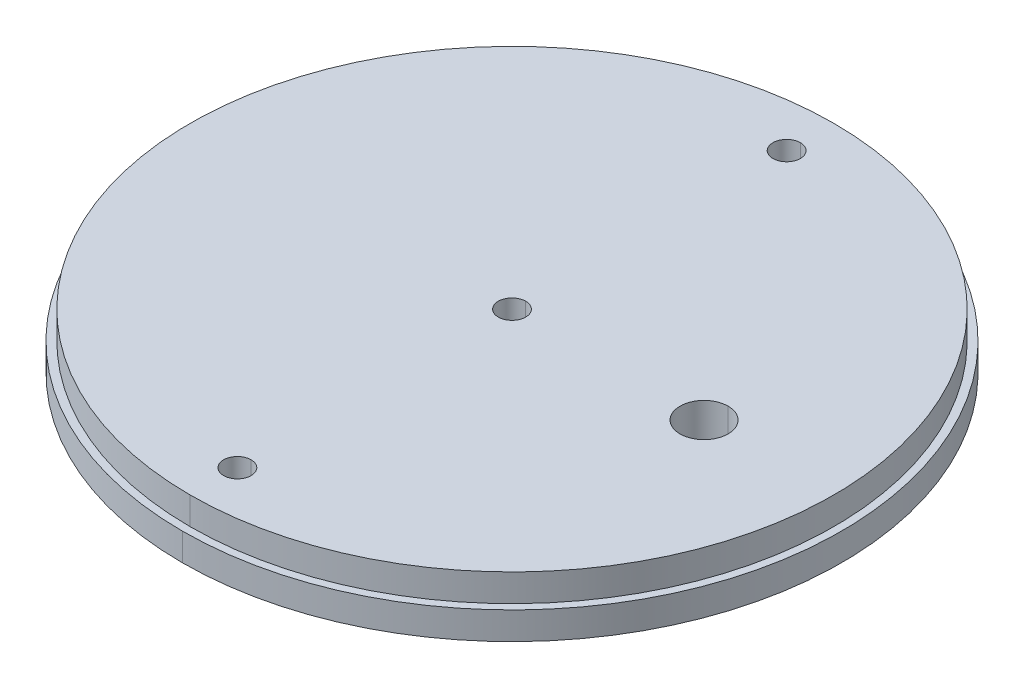
ISO-10303-21;
HEADER;
FILE_DESCRIPTION(('STEP AP214'),'2;1');
FILE_NAME('part.step','',(''),(''),'','','');
FILE_SCHEMA(('AUTOMOTIVE_DESIGN { 1 0 10303 214 1 1 1 1 }'));
ENDSEC;
DATA;
#1=APPLICATION_CONTEXT('core data for automotive mechanical design processes');
#2=APPLICATION_PROTOCOL_DEFINITION('international standard','automotive_design',2000,#1);
#3=PRODUCT_CONTEXT('',#1,'mechanical');
#4=PRODUCT('Part','Part','',(#3));
#5=PRODUCT_RELATED_PRODUCT_CATEGORY('part','',(#4));
#6=PRODUCT_DEFINITION_FORMATION('','',#4);
#7=PRODUCT_DEFINITION_CONTEXT('part definition',#1,'design');
#8=PRODUCT_DEFINITION('design','',#6,#7);
#9=PRODUCT_DEFINITION_SHAPE('','',#8);
#10=(LENGTH_UNIT() NAMED_UNIT(*) SI_UNIT(.MILLI.,.METRE.));
#11=(NAMED_UNIT(*) PLANE_ANGLE_UNIT() SI_UNIT($,.RADIAN.));
#12=(NAMED_UNIT(*) SI_UNIT($,.STERADIAN.) SOLID_ANGLE_UNIT());
#13=UNCERTAINTY_MEASURE_WITH_UNIT(LENGTH_MEASURE(1.E-05),#10,'distance_accuracy_value','');
#14=(GEOMETRIC_REPRESENTATION_CONTEXT(3) GLOBAL_UNCERTAINTY_ASSIGNED_CONTEXT((#13)) GLOBAL_UNIT_ASSIGNED_CONTEXT((#10,
#11,#12)) REPRESENTATION_CONTEXT('',''));
#15=CARTESIAN_POINT('',(0.,0.,0.));
#16=DIRECTION('',(0.,0.,1.));
#17=DIRECTION('',(1.,0.,0.));
#18=AXIS2_PLACEMENT_3D('',#15,#16,#17);
#19=CARTESIAN_POINT('',(0.,12.7,63.5));
#20=DIRECTION('',(0.,-1.,0.));
#21=DIRECTION('',(0.,0.,-1.));
#22=AXIS2_PLACEMENT_3D('',#19,#20,#21);
#23=CYLINDRICAL_SURFACE('',#22,3.175);
#24=DIRECTION('',(0.,-1.,0.));
#25=VECTOR('',#24,1.);
#26=CARTESIAN_POINT('',(0.,12.7,66.675));
#27=LINE('',#26,#25);
#28=CARTESIAN_POINT('',(0.,12.7,66.675));
#29=VERTEX_POINT('',#28);
#30=CARTESIAN_POINT('',(0.,0.,66.675));
#31=VERTEX_POINT('',#30);
#32=EDGE_CURVE('E260',#29,#31,#27,.T.);
#33=ORIENTED_EDGE('',*,*,#32,.F.);
#34=CARTESIAN_POINT('',(0.,12.7,63.5));
#35=DIRECTION('',(0.,-1.,0.));
#36=DIRECTION('',(0.,0.,-1.));
#37=AXIS2_PLACEMENT_3D('',#34,#35,#36);
#38=CIRCLE('',#37,3.175);
#39=CARTESIAN_POINT('',(0.,12.7,60.325));
#40=VERTEX_POINT('',#39);
#41=EDGE_CURVE('E83',#40,#29,#38,.T.);
#42=ORIENTED_EDGE('',*,*,#41,.F.);
#43=DIRECTION('',(0.,-1.,0.));
#44=VECTOR('',#43,1.);
#45=CARTESIAN_POINT('',(0.,12.7,60.325));
#46=LINE('',#45,#44);
#47=CARTESIAN_POINT('',(0.,0.,60.325));
#48=VERTEX_POINT('',#47);
#49=EDGE_CURVE('E284',#40,#48,#46,.T.);
#50=ORIENTED_EDGE('',*,*,#49,.T.);
#51=CARTESIAN_POINT('',(0.,0.,63.5));
#52=DIRECTION('',(0.,-1.,0.));
#53=DIRECTION('',(0.,0.,-1.));
#54=AXIS2_PLACEMENT_3D('',#51,#52,#53);
#55=CIRCLE('',#54,3.175);
#56=EDGE_CURVE('E69',#48,#31,#55,.T.);
#57=ORIENTED_EDGE('',*,*,#56,.T.);
#58=EDGE_LOOP('',(#33,#42,#50,#57));
#59=FACE_BOUND('',#58,.T.);
#60=ADVANCED_FACE('F16',(#59),#23,.F.);
#61=CARTESIAN_POINT('',(0.,12.7,-63.5));
#62=DIRECTION('',(0.,-1.,0.));
#63=DIRECTION('',(0.,0.,-1.));
#64=AXIS2_PLACEMENT_3D('',#61,#62,#63);
#65=CYLINDRICAL_SURFACE('',#64,3.175);
#66=DIRECTION('',(0.,-1.,0.));
#67=VECTOR('',#66,1.);
#68=CARTESIAN_POINT('',(0.,12.7,-60.325));
#69=LINE('',#68,#67);
#70=CARTESIAN_POINT('',(0.,12.7,-60.325));
#71=VERTEX_POINT('',#70);
#72=CARTESIAN_POINT('',(0.,0.,-60.325));
#73=VERTEX_POINT('',#72);
#74=EDGE_CURVE('E233',#71,#73,#69,.T.);
#75=ORIENTED_EDGE('',*,*,#74,.F.);
#76=CARTESIAN_POINT('',(0.,12.7,-63.5));
#77=DIRECTION('',(0.,-1.,0.));
#78=DIRECTION('',(0.,0.,-1.));
#79=AXIS2_PLACEMENT_3D('',#76,#77,#78);
#80=CIRCLE('',#79,3.175);
#81=CARTESIAN_POINT('',(0.,12.7,-66.675));
#82=VERTEX_POINT('',#81);
#83=EDGE_CURVE('E151',#82,#71,#80,.T.);
#84=ORIENTED_EDGE('',*,*,#83,.F.);
#85=DIRECTION('',(0.,-1.,0.));
#86=VECTOR('',#85,1.);
#87=CARTESIAN_POINT('',(0.,12.7,-66.675));
#88=LINE('',#87,#86);
#89=CARTESIAN_POINT('',(0.,0.,-66.675));
#90=VERTEX_POINT('',#89);
#91=EDGE_CURVE('E165',#82,#90,#88,.T.);
#92=ORIENTED_EDGE('',*,*,#91,.T.);
#93=CARTESIAN_POINT('',(0.,0.,-63.5));
#94=DIRECTION('',(0.,-1.,0.));
#95=DIRECTION('',(0.,0.,-1.));
#96=AXIS2_PLACEMENT_3D('',#93,#94,#95);
#97=CIRCLE('',#96,3.175);
#98=EDGE_CURVE('E194',#90,#73,#97,.T.);
#99=ORIENTED_EDGE('',*,*,#98,.T.);
#100=EDGE_LOOP('',(#75,#84,#92,#99));
#101=FACE_BOUND('',#100,.T.);
#102=ADVANCED_FACE('F302',(#101),#65,.F.);
#103=CARTESIAN_POINT('',(44.4093033326405,12.7,0.));
#104=DIRECTION('',(0.,-1.,0.));
#105=DIRECTION('',(0.,0.,-1.));
#106=AXIS2_PLACEMENT_3D('',#103,#104,#105);
#107=CYLINDRICAL_SURFACE('',#106,5.5626);
#108=DIRECTION('',(0.,-1.,0.));
#109=VECTOR('',#108,1.);
#110=CARTESIAN_POINT('',(44.4093033326405,12.7,5.5626));
#111=LINE('',#110,#109);
#112=CARTESIAN_POINT('',(44.4093033326405,12.7,5.5626));
#113=VERTEX_POINT('',#112);
#114=CARTESIAN_POINT('',(44.4093033326405,0.,5.5626));
#115=VERTEX_POINT('',#114);
#116=EDGE_CURVE('E154',#113,#115,#111,.T.);
#117=ORIENTED_EDGE('',*,*,#116,.F.);
#118=CARTESIAN_POINT('',(44.4093033326405,12.7,0.));
#119=DIRECTION('',(0.,-1.,0.));
#120=DIRECTION('',(0.,0.,-1.));
#121=AXIS2_PLACEMENT_3D('',#118,#119,#120);
#122=CIRCLE('',#121,5.5626);
#123=CARTESIAN_POINT('',(44.4093033326405,12.7,-5.5626));
#124=VERTEX_POINT('',#123);
#125=EDGE_CURVE('E27',#124,#113,#122,.T.);
#126=ORIENTED_EDGE('',*,*,#125,.F.);
#127=DIRECTION('',(0.,-1.,0.));
#128=VECTOR('',#127,1.);
#129=CARTESIAN_POINT('',(44.4093033326405,12.7,-5.5626));
#130=LINE('',#129,#128);
#131=CARTESIAN_POINT('',(44.4093033326405,0.,-5.5626));
#132=VERTEX_POINT('',#131);
#133=EDGE_CURVE('E163',#124,#132,#130,.T.);
#134=ORIENTED_EDGE('',*,*,#133,.T.);
#135=CARTESIAN_POINT('',(44.4093033326405,0.,0.));
#136=DIRECTION('',(0.,-1.,0.));
#137=DIRECTION('',(0.,0.,-1.));
#138=AXIS2_PLACEMENT_3D('',#135,#136,#137);
#139=CIRCLE('',#138,5.5626);
#140=EDGE_CURVE('E156',#132,#115,#139,.T.);
#141=ORIENTED_EDGE('',*,*,#140,.T.);
#142=EDGE_LOOP('',(#117,#126,#134,#141));
#143=FACE_BOUND('',#142,.T.);
#144=ADVANCED_FACE('F155',(#143),#107,.F.);
#145=CARTESIAN_POINT('',(0.,12.7,0.));
#146=DIRECTION('',(0.,-1.,0.));
#147=DIRECTION('',(0.,0.,-1.));
#148=AXIS2_PLACEMENT_3D('',#145,#146,#147);
#149=CYLINDRICAL_SURFACE('',#148,3.175);
#150=DIRECTION('',(0.,-1.,0.));
#151=VECTOR('',#150,1.);
#152=CARTESIAN_POINT('',(0.,12.7,3.175));
#153=LINE('',#152,#151);
#154=CARTESIAN_POINT('',(0.,12.7,3.175));
#155=VERTEX_POINT('',#154);
#156=CARTESIAN_POINT('',(0.,0.,3.175));
#157=VERTEX_POINT('',#156);
#158=EDGE_CURVE('E228',#155,#157,#153,.T.);
#159=ORIENTED_EDGE('',*,*,#158,.F.);
#160=CARTESIAN_POINT('',(0.,12.7,0.));
#161=DIRECTION('',(0.,-1.,0.));
#162=DIRECTION('',(0.,0.,-1.));
#163=AXIS2_PLACEMENT_3D('',#160,#161,#162);
#164=CIRCLE('',#163,3.175);
#165=CARTESIAN_POINT('',(0.,12.7,-3.175));
#166=VERTEX_POINT('',#165);
#167=EDGE_CURVE('E11',#166,#155,#164,.T.);
#168=ORIENTED_EDGE('',*,*,#167,.F.);
#169=DIRECTION('',(0.,-1.,0.));
#170=VECTOR('',#169,1.);
#171=CARTESIAN_POINT('',(0.,12.7,-3.175));
#172=LINE('',#171,#170);
#173=CARTESIAN_POINT('',(0.,0.,-3.175));
#174=VERTEX_POINT('',#173);
#175=EDGE_CURVE('E216',#166,#174,#172,.T.);
#176=ORIENTED_EDGE('',*,*,#175,.T.);
#177=CARTESIAN_POINT('',(0.,0.,0.));
#178=DIRECTION('',(0.,-1.,0.));
#179=DIRECTION('',(0.,0.,-1.));
#180=AXIS2_PLACEMENT_3D('',#177,#178,#179);
#181=CIRCLE('',#180,3.175);
#182=EDGE_CURVE('E247',#174,#157,#181,.T.);
#183=ORIENTED_EDGE('',*,*,#182,.T.);
#184=EDGE_LOOP('',(#159,#168,#176,#183));
#185=FACE_BOUND('',#184,.T.);
#186=ADVANCED_FACE('F313',(#185),#149,.F.);
#187=CARTESIAN_POINT('',(0.,12.7,0.));
#188=DIRECTION('',(0.,1.,0.));
#189=DIRECTION('',(1.,0.,0.));
#190=AXIS2_PLACEMENT_3D('',#187,#188,#189);
#191=PLANE('',#190);
#192=ORIENTED_EDGE('',*,*,#167,.T.);
#193=CARTESIAN_POINT('',(0.,12.7,0.));
#194=DIRECTION('',(0.,-1.,0.));
#195=DIRECTION('',(0.,0.,-1.));
#196=AXIS2_PLACEMENT_3D('',#193,#194,#195);
#197=CIRCLE('',#196,3.175);
#198=EDGE_CURVE('E232',#155,#166,#197,.T.);
#199=ORIENTED_EDGE('',*,*,#198,.T.);
#200=EDGE_LOOP('',(#192,#199));
#201=FACE_BOUND('',#200,.T.);
#202=ORIENTED_EDGE('',*,*,#125,.T.);
#203=CARTESIAN_POINT('',(44.4093033326405,12.7,0.));
#204=DIRECTION('',(0.,-1.,0.));
#205=DIRECTION('',(0.,0.,-1.));
#206=AXIS2_PLACEMENT_3D('',#203,#204,#205);
#207=CIRCLE('',#206,5.5626);
#208=EDGE_CURVE('E146',#113,#124,#207,.T.);
#209=ORIENTED_EDGE('',*,*,#208,.T.);
#210=EDGE_LOOP('',(#202,#209));
#211=FACE_BOUND('',#210,.T.);
#212=ORIENTED_EDGE('',*,*,#83,.T.);
#213=CARTESIAN_POINT('',(0.,12.7,-63.5));
#214=DIRECTION('',(0.,-1.,0.));
#215=DIRECTION('',(0.,0.,-1.));
#216=AXIS2_PLACEMENT_3D('',#213,#214,#215);
#217=CIRCLE('',#216,3.175);
#218=EDGE_CURVE('E237',#71,#82,#217,.T.);
#219=ORIENTED_EDGE('',*,*,#218,.T.);
#220=EDGE_LOOP('',(#212,#219));
#221=FACE_BOUND('',#220,.T.);
#222=ORIENTED_EDGE('',*,*,#41,.T.);
#223=CARTESIAN_POINT('',(0.,12.7,63.5));
#224=DIRECTION('',(0.,-1.,0.));
#225=DIRECTION('',(0.,0.,-1.));
#226=AXIS2_PLACEMENT_3D('',#223,#224,#225);
#227=CIRCLE('',#226,3.175);
#228=EDGE_CURVE('E256',#29,#40,#227,.T.);
#229=ORIENTED_EDGE('',*,*,#228,.T.);
#230=EDGE_LOOP('',(#222,#229));
#231=FACE_BOUND('',#230,.T.);
#232=CARTESIAN_POINT('',(0.,12.7,0.));
#233=DIRECTION('',(0.,1.,0.));
#234=DIRECTION('',(0.,0.,1.));
#235=AXIS2_PLACEMENT_3D('',#232,#233,#234);
#236=CIRCLE('',#235,74.422);
#237=CARTESIAN_POINT('',(0.,12.7,-74.422));
#238=VERTEX_POINT('',#237);
#239=CARTESIAN_POINT('',(0.,12.7,74.422));
#240=VERTEX_POINT('',#239);
#241=EDGE_CURVE('E178',#238,#240,#236,.T.);
#242=ORIENTED_EDGE('',*,*,#241,.T.);
#243=CARTESIAN_POINT('',(0.,12.7,0.));
#244=DIRECTION('',(0.,1.,0.));
#245=DIRECTION('',(0.,0.,1.));
#246=AXIS2_PLACEMENT_3D('',#243,#244,#245);
#247=CIRCLE('',#246,74.422);
#248=EDGE_CURVE('E211',#240,#238,#247,.T.);
#249=ORIENTED_EDGE('',*,*,#248,.T.);
#250=EDGE_LOOP('',(#242,#249));
#251=FACE_BOUND('',#250,.T.);
#252=ADVANCED_FACE('F143',(#201,#211,#221,#231,#251),#191,.T.);
#253=CARTESIAN_POINT('',(0.,12.7,0.));
#254=DIRECTION('',(0.,-1.,0.));
#255=DIRECTION('',(0.,0.,-1.));
#256=AXIS2_PLACEMENT_3D('',#253,#254,#255);
#257=CYLINDRICAL_SURFACE('',#256,74.422);
#258=DIRECTION('',(0.,-1.,0.));
#259=VECTOR('',#258,1.);
#260=CARTESIAN_POINT('',(0.,12.7,74.422));
#261=LINE('',#260,#259);
#262=CARTESIAN_POINT('',(0.,6.35,74.422));
#263=VERTEX_POINT('',#262);
#264=EDGE_CURVE('E215',#240,#263,#261,.T.);
#265=ORIENTED_EDGE('',*,*,#264,.F.);
#266=ORIENTED_EDGE('',*,*,#241,.F.);
#267=DIRECTION('',(0.,-1.,0.));
#268=VECTOR('',#267,1.);
#269=CARTESIAN_POINT('',(0.,12.7,-74.422));
#270=LINE('',#269,#268);
#271=CARTESIAN_POINT('',(0.,6.35,-74.422));
#272=VERTEX_POINT('',#271);
#273=EDGE_CURVE('E189',#238,#272,#270,.T.);
#274=ORIENTED_EDGE('',*,*,#273,.T.);
#275=CARTESIAN_POINT('',(0.,6.35,0.));
#276=DIRECTION('',(0.,1.,0.));
#277=DIRECTION('',(0.,0.,1.));
#278=AXIS2_PLACEMENT_3D('',#275,#276,#277);
#279=CIRCLE('',#278,74.422);
#280=EDGE_CURVE('E195',#272,#263,#279,.T.);
#281=ORIENTED_EDGE('',*,*,#280,.T.);
#282=EDGE_LOOP('',(#265,#266,#274,#281));
#283=FACE_BOUND('',#282,.T.);
#284=ADVANCED_FACE('F274',(#283),#257,.T.);
#285=CARTESIAN_POINT('',(0.,0.,0.));
#286=DIRECTION('',(0.,1.,0.));
#287=DIRECTION('',(1.,0.,0.));
#288=AXIS2_PLACEMENT_3D('',#285,#286,#287);
#289=PLANE('',#288);
#290=ORIENTED_EDGE('',*,*,#182,.F.);
#291=CARTESIAN_POINT('',(0.,0.,0.));
#292=DIRECTION('',(0.,-1.,0.));
#293=DIRECTION('',(0.,0.,-1.));
#294=AXIS2_PLACEMENT_3D('',#291,#292,#293);
#295=CIRCLE('',#294,3.175);
#296=EDGE_CURVE('E220',#157,#174,#295,.T.);
#297=ORIENTED_EDGE('',*,*,#296,.F.);
#298=EDGE_LOOP('',(#290,#297));
#299=FACE_BOUND('',#298,.T.);
#300=ORIENTED_EDGE('',*,*,#140,.F.);
#301=CARTESIAN_POINT('',(44.4093033326405,0.,0.));
#302=DIRECTION('',(0.,-1.,0.));
#303=DIRECTION('',(0.,0.,-1.));
#304=AXIS2_PLACEMENT_3D('',#301,#302,#303);
#305=CIRCLE('',#304,5.5626);
#306=EDGE_CURVE('E20',#115,#132,#305,.T.);
#307=ORIENTED_EDGE('',*,*,#306,.F.);
#308=EDGE_LOOP('',(#300,#307));
#309=FACE_BOUND('',#308,.T.);
#310=ORIENTED_EDGE('',*,*,#98,.F.);
#311=CARTESIAN_POINT('',(0.,0.,-63.5));
#312=DIRECTION('',(0.,-1.,0.));
#313=DIRECTION('',(0.,0.,-1.));
#314=AXIS2_PLACEMENT_3D('',#311,#312,#313);
#315=CIRCLE('',#314,3.175);
#316=EDGE_CURVE('E172',#73,#90,#315,.T.);
#317=ORIENTED_EDGE('',*,*,#316,.F.);
#318=EDGE_LOOP('',(#310,#317));
#319=FACE_BOUND('',#318,.T.);
#320=ORIENTED_EDGE('',*,*,#56,.F.);
#321=CARTESIAN_POINT('',(0.,0.,63.5));
#322=DIRECTION('',(0.,-1.,0.));
#323=DIRECTION('',(0.,0.,-1.));
#324=AXIS2_PLACEMENT_3D('',#321,#322,#323);
#325=CIRCLE('',#324,3.175);
#326=EDGE_CURVE('E283',#31,#48,#325,.T.);
#327=ORIENTED_EDGE('',*,*,#326,.F.);
#328=EDGE_LOOP('',(#320,#327));
#329=FACE_BOUND('',#328,.T.);
#330=CARTESIAN_POINT('',(0.,0.,0.));
#331=DIRECTION('',(0.,1.,0.));
#332=DIRECTION('',(0.,0.,1.));
#333=AXIS2_PLACEMENT_3D('',#330,#331,#332);
#334=CIRCLE('',#333,76.2);
#335=CARTESIAN_POINT('',(0.,0.,-76.2));
#336=VERTEX_POINT('',#335);
#337=CARTESIAN_POINT('',(0.,0.,76.2));
#338=VERTEX_POINT('',#337);
#339=EDGE_CURVE('E41',#336,#338,#334,.T.);
#340=ORIENTED_EDGE('',*,*,#339,.F.);
#341=CARTESIAN_POINT('',(0.,0.,0.));
#342=DIRECTION('',(0.,1.,0.));
#343=DIRECTION('',(0.,0.,1.));
#344=AXIS2_PLACEMENT_3D('',#341,#342,#343);
#345=CIRCLE('',#344,76.2);
#346=EDGE_CURVE('E221',#338,#336,#345,.T.);
#347=ORIENTED_EDGE('',*,*,#346,.F.);
#348=EDGE_LOOP('',(#340,#347));
#349=FACE_BOUND('',#348,.T.);
#350=ADVANCED_FACE('F304',(#299,#309,#319,#329,#349),#289,.F.);
#351=CARTESIAN_POINT('',(0.,6.35,0.));
#352=DIRECTION('',(0.,1.,0.));
#353=DIRECTION('',(1.,0.,0.));
#354=AXIS2_PLACEMENT_3D('',#351,#352,#353);
#355=PLANE('',#354);
#356=ORIENTED_EDGE('',*,*,#280,.F.);
#357=CARTESIAN_POINT('',(0.,6.35,0.));
#358=DIRECTION('',(0.,1.,0.));
#359=DIRECTION('',(0.,0.,1.));
#360=AXIS2_PLACEMENT_3D('',#357,#358,#359);
#361=CIRCLE('',#360,74.422);
#362=EDGE_CURVE('E192',#263,#272,#361,.T.);
#363=ORIENTED_EDGE('',*,*,#362,.F.);
#364=EDGE_LOOP('',(#356,#363));
#365=FACE_BOUND('',#364,.T.);
#366=CARTESIAN_POINT('',(0.,6.35,0.));
#367=DIRECTION('',(0.,1.,0.));
#368=DIRECTION('',(0.,0.,1.));
#369=AXIS2_PLACEMENT_3D('',#366,#367,#368);
#370=CIRCLE('',#369,76.2);
#371=CARTESIAN_POINT('',(0.,6.35,-76.2));
#372=VERTEX_POINT('',#371);
#373=CARTESIAN_POINT('',(0.,6.35,76.2));
#374=VERTEX_POINT('',#373);
#375=EDGE_CURVE('E179',#372,#374,#370,.T.);
#376=ORIENTED_EDGE('',*,*,#375,.T.);
#377=CARTESIAN_POINT('',(0.,6.35,0.));
#378=DIRECTION('',(0.,1.,0.));
#379=DIRECTION('',(0.,0.,1.));
#380=AXIS2_PLACEMENT_3D('',#377,#378,#379);
#381=CIRCLE('',#380,76.2);
#382=EDGE_CURVE('E184',#374,#372,#381,.T.);
#383=ORIENTED_EDGE('',*,*,#382,.T.);
#384=EDGE_LOOP('',(#376,#383));
#385=FACE_BOUND('',#384,.T.);
#386=ADVANCED_FACE('F18',(#365,#385),#355,.T.);
#387=CARTESIAN_POINT('',(0.,6.35,0.));
#388=DIRECTION('',(0.,-1.,0.));
#389=DIRECTION('',(0.,0.,-1.));
#390=AXIS2_PLACEMENT_3D('',#387,#388,#389);
#391=CYLINDRICAL_SURFACE('',#390,76.2);
#392=DIRECTION('',(0.,-1.,0.));
#393=VECTOR('',#392,1.);
#394=CARTESIAN_POINT('',(0.,6.35,76.2));
#395=LINE('',#394,#393);
#396=EDGE_CURVE('E188',#374,#338,#395,.T.);
#397=ORIENTED_EDGE('',*,*,#396,.F.);
#398=ORIENTED_EDGE('',*,*,#375,.F.);
#399=DIRECTION('',(0.,-1.,0.));
#400=VECTOR('',#399,1.);
#401=CARTESIAN_POINT('',(0.,6.35,-76.2));
#402=LINE('',#401,#400);
#403=EDGE_CURVE('E183',#372,#336,#402,.T.);
#404=ORIENTED_EDGE('',*,*,#403,.T.);
#405=ORIENTED_EDGE('',*,*,#339,.T.);
#406=EDGE_LOOP('',(#397,#398,#404,#405));
#407=FACE_BOUND('',#406,.T.);
#408=ADVANCED_FACE('F386',(#407),#391,.T.);
#409=CARTESIAN_POINT('',(0.,6.35,0.));
#410=DIRECTION('',(0.,-1.,0.));
#411=DIRECTION('',(0.,0.,-1.));
#412=AXIS2_PLACEMENT_3D('',#409,#410,#411);
#413=CYLINDRICAL_SURFACE('',#412,76.2);
#414=ORIENTED_EDGE('',*,*,#382,.F.);
#415=ORIENTED_EDGE('',*,*,#396,.T.);
#416=ORIENTED_EDGE('',*,*,#346,.T.);
#417=ORIENTED_EDGE('',*,*,#403,.F.);
#418=EDGE_LOOP('',(#414,#415,#416,#417));
#419=FACE_BOUND('',#418,.T.);
#420=ADVANCED_FACE('F340',(#419),#413,.T.);
#421=CARTESIAN_POINT('',(0.,12.7,0.));
#422=DIRECTION('',(0.,-1.,0.));
#423=DIRECTION('',(0.,0.,-1.));
#424=AXIS2_PLACEMENT_3D('',#421,#422,#423);
#425=CYLINDRICAL_SURFACE('',#424,74.422);
#426=ORIENTED_EDGE('',*,*,#248,.F.);
#427=ORIENTED_EDGE('',*,*,#264,.T.);
#428=ORIENTED_EDGE('',*,*,#362,.T.);
#429=ORIENTED_EDGE('',*,*,#273,.F.);
#430=EDGE_LOOP('',(#426,#427,#428,#429));
#431=FACE_BOUND('',#430,.T.);
#432=ADVANCED_FACE('F273',(#431),#425,.T.);
#433=CARTESIAN_POINT('',(0.,12.7,0.));
#434=DIRECTION('',(0.,-1.,0.));
#435=DIRECTION('',(0.,0.,-1.));
#436=AXIS2_PLACEMENT_3D('',#433,#434,#435);
#437=CYLINDRICAL_SURFACE('',#436,3.175);
#438=ORIENTED_EDGE('',*,*,#198,.F.);
#439=ORIENTED_EDGE('',*,*,#158,.T.);
#440=ORIENTED_EDGE('',*,*,#296,.T.);
#441=ORIENTED_EDGE('',*,*,#175,.F.);
#442=EDGE_LOOP('',(#438,#439,#440,#441));
#443=FACE_BOUND('',#442,.T.);
#444=ADVANCED_FACE('F337',(#443),#437,.F.);
#445=CARTESIAN_POINT('',(44.4093033326405,12.7,0.));
#446=DIRECTION('',(0.,-1.,0.));
#447=DIRECTION('',(0.,0.,-1.));
#448=AXIS2_PLACEMENT_3D('',#445,#446,#447);
#449=CYLINDRICAL_SURFACE('',#448,5.5626);
#450=ORIENTED_EDGE('',*,*,#208,.F.);
#451=ORIENTED_EDGE('',*,*,#116,.T.);
#452=ORIENTED_EDGE('',*,*,#306,.T.);
#453=ORIENTED_EDGE('',*,*,#133,.F.);
#454=EDGE_LOOP('',(#450,#451,#452,#453));
#455=FACE_BOUND('',#454,.T.);
#456=ADVANCED_FACE('F162',(#455),#449,.F.);
#457=CARTESIAN_POINT('',(0.,12.7,-63.5));
#458=DIRECTION('',(0.,-1.,0.));
#459=DIRECTION('',(0.,0.,-1.));
#460=AXIS2_PLACEMENT_3D('',#457,#458,#459);
#461=CYLINDRICAL_SURFACE('',#460,3.175);
#462=ORIENTED_EDGE('',*,*,#218,.F.);
#463=ORIENTED_EDGE('',*,*,#74,.T.);
#464=ORIENTED_EDGE('',*,*,#316,.T.);
#465=ORIENTED_EDGE('',*,*,#91,.F.);
#466=EDGE_LOOP('',(#462,#463,#464,#465));
#467=FACE_BOUND('',#466,.T.);
#468=ADVANCED_FACE('F299',(#467),#461,.F.);
#469=CARTESIAN_POINT('',(0.,12.7,63.5));
#470=DIRECTION('',(0.,-1.,0.));
#471=DIRECTION('',(0.,0.,-1.));
#472=AXIS2_PLACEMENT_3D('',#469,#470,#471);
#473=CYLINDRICAL_SURFACE('',#472,3.175);
#474=ORIENTED_EDGE('',*,*,#228,.F.);
#475=ORIENTED_EDGE('',*,*,#32,.T.);
#476=ORIENTED_EDGE('',*,*,#326,.T.);
#477=ORIENTED_EDGE('',*,*,#49,.F.);
#478=EDGE_LOOP('',(#474,#475,#476,#477));
#479=FACE_BOUND('',#478,.T.);
#480=ADVANCED_FACE('F311',(#479),#473,.F.);
#481=CLOSED_SHELL('',(#60,#102,#144,#186,#252,#284,#350,#386,#408,#420,#432,#444,#456,#468,#480));
#482=MANIFOLD_SOLID_BREP('B1',#481);
#483=ADVANCED_BREP_SHAPE_REPRESENTATION('',(#18,#482),#14);
#484=SHAPE_DEFINITION_REPRESENTATION(#9,#483);
ENDSEC;
END-ISO-10303-21;
